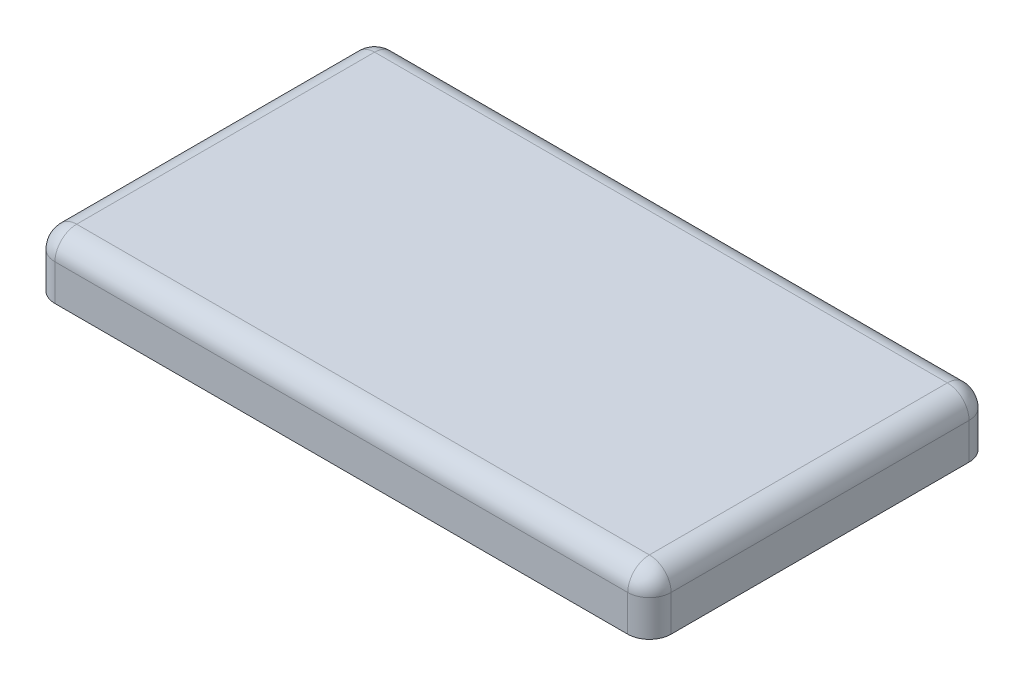
ISO-10303-21;
HEADER;
FILE_DESCRIPTION(('STEP AP214'),'2;1');
FILE_NAME('part.step','',(''),(''),'','','');
FILE_SCHEMA(('AUTOMOTIVE_DESIGN { 1 0 10303 214 1 1 1 1 }'));
ENDSEC;
DATA;
#1=APPLICATION_CONTEXT('core data for automotive mechanical design processes');
#2=APPLICATION_PROTOCOL_DEFINITION('international standard','automotive_design',2000,#1);
#3=PRODUCT_CONTEXT('',#1,'mechanical');
#4=PRODUCT('Part','Part','',(#3));
#5=PRODUCT_RELATED_PRODUCT_CATEGORY('part','',(#4));
#6=PRODUCT_DEFINITION_FORMATION('','',#4);
#7=PRODUCT_DEFINITION_CONTEXT('part definition',#1,'design');
#8=PRODUCT_DEFINITION('design','',#6,#7);
#9=PRODUCT_DEFINITION_SHAPE('','',#8);
#10=(LENGTH_UNIT() NAMED_UNIT(*) SI_UNIT(.MILLI.,.METRE.));
#11=(NAMED_UNIT(*) PLANE_ANGLE_UNIT() SI_UNIT($,.RADIAN.));
#12=(NAMED_UNIT(*) SI_UNIT($,.STERADIAN.) SOLID_ANGLE_UNIT());
#13=UNCERTAINTY_MEASURE_WITH_UNIT(LENGTH_MEASURE(1.E-05),#10,'distance_accuracy_value','');
#14=(GEOMETRIC_REPRESENTATION_CONTEXT(3) GLOBAL_UNCERTAINTY_ASSIGNED_CONTEXT((#13)) GLOBAL_UNIT_ASSIGNED_CONTEXT((#10,
#11,#12)) REPRESENTATION_CONTEXT('',''));
#15=CARTESIAN_POINT('',(0.,0.,0.));
#16=DIRECTION('',(0.,0.,1.));
#17=DIRECTION('',(1.,0.,0.));
#18=AXIS2_PLACEMENT_3D('',#15,#16,#17);
#19=CARTESIAN_POINT('',(0.,4.,0.));
#20=DIRECTION('',(1.,0.,0.));
#21=DIRECTION('',(0.,0.,-1.));
#22=AXIS2_PLACEMENT_3D('',#19,#20,#21);
#23=PLANE('',#22);
#24=DIRECTION('',(0.,0.,1.));
#25=VECTOR('',#24,1.);
#26=CARTESIAN_POINT('',(0.,0.,0.));
#27=LINE('',#26,#25);
#28=CARTESIAN_POINT('',(0.,0.,-22.1));
#29=VERTEX_POINT('',#28);
#30=CARTESIAN_POINT('',(0.,0.,-1.5));
#31=VERTEX_POINT('',#30);
#32=EDGE_CURVE('E175',#29,#31,#27,.T.);
#33=ORIENTED_EDGE('',*,*,#32,.T.);
#34=DIRECTION('',(0.,-1.,0.));
#35=VECTOR('',#34,1.);
#36=CARTESIAN_POINT('',(0.,4.,-1.5));
#37=LINE('',#36,#35);
#38=CARTESIAN_POINT('',(0.,2.5,-1.5));
#39=VERTEX_POINT('',#38);
#40=EDGE_CURVE('E51',#31,#39,#37,.F.);
#41=ORIENTED_EDGE('',*,*,#40,.T.);
#42=DIRECTION('',(0.,0.,1.));
#43=VECTOR('',#42,1.);
#44=CARTESIAN_POINT('',(0.,2.5,0.));
#45=LINE('',#44,#43);
#46=CARTESIAN_POINT('',(0.,2.5,-22.1));
#47=VERTEX_POINT('',#46);
#48=EDGE_CURVE('E56',#39,#47,#45,.F.);
#49=ORIENTED_EDGE('',*,*,#48,.T.);
#50=DIRECTION('',(0.,-1.,0.));
#51=VECTOR('',#50,1.);
#52=CARTESIAN_POINT('',(0.,4.,-22.1));
#53=LINE('',#52,#51);
#54=EDGE_CURVE('E217',#47,#29,#53,.T.);
#55=ORIENTED_EDGE('',*,*,#54,.T.);
#56=EDGE_LOOP('',(#33,#41,#49,#55));
#57=FACE_BOUND('',#56,.T.);
#58=ADVANCED_FACE('F34',(#57),#23,.F.);
#59=CARTESIAN_POINT('',(0.,4.,0.));
#60=DIRECTION('',(0.,0.,-1.));
#61=DIRECTION('',(-1.,0.,0.));
#62=AXIS2_PLACEMENT_3D('',#59,#60,#61);
#63=PLANE('',#62);
#64=DIRECTION('',(1.,0.,0.));
#65=VECTOR('',#64,1.);
#66=CARTESIAN_POINT('',(0.,2.5,0.));
#67=LINE('',#66,#65);
#68=CARTESIAN_POINT('',(41.1,2.5,0.));
#69=VERTEX_POINT('',#68);
#70=CARTESIAN_POINT('',(1.5,2.5,0.));
#71=VERTEX_POINT('',#70);
#72=EDGE_CURVE('E213',#69,#71,#67,.F.);
#73=ORIENTED_EDGE('',*,*,#72,.T.);
#74=DIRECTION('',(0.,-1.,0.));
#75=VECTOR('',#74,1.);
#76=CARTESIAN_POINT('',(1.5,4.,0.));
#77=LINE('',#76,#75);
#78=CARTESIAN_POINT('',(1.5,0.,0.));
#79=VERTEX_POINT('',#78);
#80=EDGE_CURVE('E215',#71,#79,#77,.T.);
#81=ORIENTED_EDGE('',*,*,#80,.T.);
#82=DIRECTION('',(1.,0.,0.));
#83=VECTOR('',#82,1.);
#84=CARTESIAN_POINT('',(0.,0.,0.));
#85=LINE('',#84,#83);
#86=CARTESIAN_POINT('',(41.1,0.,0.));
#87=VERTEX_POINT('',#86);
#88=EDGE_CURVE('E180',#79,#87,#85,.T.);
#89=ORIENTED_EDGE('',*,*,#88,.T.);
#90=DIRECTION('',(0.,-1.,0.));
#91=VECTOR('',#90,1.);
#92=CARTESIAN_POINT('',(41.1,4.,0.));
#93=LINE('',#92,#91);
#94=EDGE_CURVE('E211',#87,#69,#93,.F.);
#95=ORIENTED_EDGE('',*,*,#94,.T.);
#96=EDGE_LOOP('',(#73,#81,#89,#95));
#97=FACE_BOUND('',#96,.T.);
#98=ADVANCED_FACE('F282',(#97),#63,.F.);
#99=CARTESIAN_POINT('',(42.6,4.,0.));
#100=DIRECTION('',(-1.,0.,0.));
#101=DIRECTION('',(0.,0.,1.));
#102=AXIS2_PLACEMENT_3D('',#99,#100,#101);
#103=PLANE('',#102);
#104=DIRECTION('',(0.,0.,-1.));
#105=VECTOR('',#104,1.);
#106=CARTESIAN_POINT('',(42.6,0.,0.));
#107=LINE('',#106,#105);
#108=CARTESIAN_POINT('',(42.6,0.,-1.5));
#109=VERTEX_POINT('',#108);
#110=CARTESIAN_POINT('',(42.6,0.,-22.1));
#111=VERTEX_POINT('',#110);
#112=EDGE_CURVE('E183',#109,#111,#107,.T.);
#113=ORIENTED_EDGE('',*,*,#112,.T.);
#114=DIRECTION('',(0.,-1.,0.));
#115=VECTOR('',#114,1.);
#116=CARTESIAN_POINT('',(42.6,4.,-22.1));
#117=LINE('',#116,#115);
#118=CARTESIAN_POINT('',(42.6,2.5,-22.1));
#119=VERTEX_POINT('',#118);
#120=EDGE_CURVE('E209',#111,#119,#117,.F.);
#121=ORIENTED_EDGE('',*,*,#120,.T.);
#122=DIRECTION('',(0.,0.,-1.));
#123=VECTOR('',#122,1.);
#124=CARTESIAN_POINT('',(42.6,2.5,0.));
#125=LINE('',#124,#123);
#126=CARTESIAN_POINT('',(42.6,2.5,-1.5));
#127=VERTEX_POINT('',#126);
#128=EDGE_CURVE('E207',#119,#127,#125,.F.);
#129=ORIENTED_EDGE('',*,*,#128,.T.);
#130=DIRECTION('',(0.,-1.,0.));
#131=VECTOR('',#130,1.);
#132=CARTESIAN_POINT('',(42.6,4.,-1.5));
#133=LINE('',#132,#131);
#134=EDGE_CURVE('E205',#127,#109,#133,.T.);
#135=ORIENTED_EDGE('',*,*,#134,.T.);
#136=EDGE_LOOP('',(#113,#121,#129,#135));
#137=FACE_BOUND('',#136,.T.);
#138=ADVANCED_FACE('F315',(#137),#103,.F.);
#139=CARTESIAN_POINT('',(0.,4.,-23.6));
#140=DIRECTION('',(0.,0.,1.));
#141=DIRECTION('',(1.,0.,0.));
#142=AXIS2_PLACEMENT_3D('',#139,#140,#141);
#143=PLANE('',#142);
#144=DIRECTION('',(-1.,0.,0.));
#145=VECTOR('',#144,1.);
#146=CARTESIAN_POINT('',(0.,0.,-23.6));
#147=LINE('',#146,#145);
#148=CARTESIAN_POINT('',(41.1,0.,-23.6));
#149=VERTEX_POINT('',#148);
#150=CARTESIAN_POINT('',(1.49999999999999,0.,-23.6));
#151=VERTEX_POINT('',#150);
#152=EDGE_CURVE('E186',#149,#151,#147,.T.);
#153=ORIENTED_EDGE('',*,*,#152,.T.);
#154=DIRECTION('',(0.,-1.,0.));
#155=VECTOR('',#154,1.);
#156=CARTESIAN_POINT('',(1.49999999999999,4.,-23.6));
#157=LINE('',#156,#155);
#158=CARTESIAN_POINT('',(1.49999999999999,2.5,-23.6));
#159=VERTEX_POINT('',#158);
#160=EDGE_CURVE('E203',#151,#159,#157,.F.);
#161=ORIENTED_EDGE('',*,*,#160,.T.);
#162=DIRECTION('',(-1.,0.,0.));
#163=VECTOR('',#162,1.);
#164=CARTESIAN_POINT('',(0.,2.5,-23.6));
#165=LINE('',#164,#163);
#166=CARTESIAN_POINT('',(41.1,2.5,-23.6));
#167=VERTEX_POINT('',#166);
#168=EDGE_CURVE('E200',#159,#167,#165,.F.);
#169=ORIENTED_EDGE('',*,*,#168,.T.);
#170=DIRECTION('',(0.,-1.,0.));
#171=VECTOR('',#170,1.);
#172=CARTESIAN_POINT('',(41.1,4.,-23.6));
#173=LINE('',#172,#171);
#174=EDGE_CURVE('E198',#167,#149,#173,.T.);
#175=ORIENTED_EDGE('',*,*,#174,.T.);
#176=EDGE_LOOP('',(#153,#161,#169,#175));
#177=FACE_BOUND('',#176,.T.);
#178=ADVANCED_FACE('F306',(#177),#143,.F.);
#179=CARTESIAN_POINT('',(0.,4.,0.));
#180=DIRECTION('',(0.,-1.,0.));
#181=DIRECTION('',(0.,0.,-1.));
#182=AXIS2_PLACEMENT_3D('',#179,#180,#181);
#183=PLANE('',#182);
#184=DIRECTION('',(0.,0.,-1.));
#185=VECTOR('',#184,1.);
#186=CARTESIAN_POINT('',(41.1,4.,0.));
#187=LINE('',#186,#185);
#188=CARTESIAN_POINT('',(41.1,4.,-1.5));
#189=VERTEX_POINT('',#188);
#190=CARTESIAN_POINT('',(41.1,4.,-22.1));
#191=VERTEX_POINT('',#190);
#192=EDGE_CURVE('E193',#189,#191,#187,.T.);
#193=ORIENTED_EDGE('',*,*,#192,.T.);
#194=DIRECTION('',(-1.,0.,0.));
#195=VECTOR('',#194,1.);
#196=CARTESIAN_POINT('',(0.,4.,-22.1));
#197=LINE('',#196,#195);
#198=CARTESIAN_POINT('',(1.49999999999999,4.,-22.1));
#199=VERTEX_POINT('',#198);
#200=EDGE_CURVE('E195',#191,#199,#197,.T.);
#201=ORIENTED_EDGE('',*,*,#200,.T.);
#202=DIRECTION('',(0.,0.,1.));
#203=VECTOR('',#202,1.);
#204=CARTESIAN_POINT('',(1.5,4.,0.));
#205=LINE('',#204,#203);
#206=CARTESIAN_POINT('',(1.5,4.,-1.5));
#207=VERTEX_POINT('',#206);
#208=EDGE_CURVE('E189',#199,#207,#205,.T.);
#209=ORIENTED_EDGE('',*,*,#208,.T.);
#210=DIRECTION('',(1.,0.,0.));
#211=VECTOR('',#210,1.);
#212=CARTESIAN_POINT('',(0.,4.,-1.5));
#213=LINE('',#212,#211);
#214=EDGE_CURVE('E191',#207,#189,#213,.T.);
#215=ORIENTED_EDGE('',*,*,#214,.T.);
#216=EDGE_LOOP('',(#193,#201,#209,#215));
#217=FACE_BOUND('',#216,.T.);
#218=ADVANCED_FACE('F272',(#217),#183,.F.);
#219=CARTESIAN_POINT('',(0.,0.,0.));
#220=DIRECTION('',(0.,-1.,0.));
#221=DIRECTION('',(0.,0.,-1.));
#222=AXIS2_PLACEMENT_3D('',#219,#220,#221);
#223=PLANE('',#222);
#224=DIRECTION('',(0.,0.,1.));
#225=VECTOR('',#224,1.);
#226=CARTESIAN_POINT('',(41.35,0.,-22.35));
#227=LINE('',#226,#225);
#228=CARTESIAN_POINT('',(41.35,0.,-22.35));
#229=VERTEX_POINT('',#228);
#230=CARTESIAN_POINT('',(41.35,0.,-1.25));
#231=VERTEX_POINT('',#230);
#232=EDGE_CURVE('E143',#229,#231,#227,.T.);
#233=ORIENTED_EDGE('',*,*,#232,.F.);
#234=DIRECTION('',(1.,0.,0.));
#235=VECTOR('',#234,1.);
#236=CARTESIAN_POINT('',(1.24999999999999,0.,-22.35));
#237=LINE('',#236,#235);
#238=CARTESIAN_POINT('',(1.24999999999999,0.,-22.35));
#239=VERTEX_POINT('',#238);
#240=EDGE_CURVE('E160',#239,#229,#237,.T.);
#241=ORIENTED_EDGE('',*,*,#240,.F.);
#242=DIRECTION('',(0.,0.,-1.));
#243=VECTOR('',#242,1.);
#244=CARTESIAN_POINT('',(1.24999999999999,0.,-22.35));
#245=LINE('',#244,#243);
#246=CARTESIAN_POINT('',(1.24999999999999,0.,-1.25));
#247=VERTEX_POINT('',#246);
#248=EDGE_CURVE('E163',#247,#239,#245,.T.);
#249=ORIENTED_EDGE('',*,*,#248,.F.);
#250=DIRECTION('',(-1.,0.,0.));
#251=VECTOR('',#250,1.);
#252=CARTESIAN_POINT('',(1.24999999999999,0.,-1.25));
#253=LINE('',#252,#251);
#254=EDGE_CURVE('E169',#231,#247,#253,.T.);
#255=ORIENTED_EDGE('',*,*,#254,.F.);
#256=EDGE_LOOP('',(#233,#241,#249,#255));
#257=FACE_BOUND('',#256,.T.);
#258=ORIENTED_EDGE('',*,*,#88,.F.);
#259=CARTESIAN_POINT('',(1.5,0.,-1.5));
#260=DIRECTION('',(0.,-1.,0.));
#261=DIRECTION('',(0.,0.,-1.));
#262=AXIS2_PLACEMENT_3D('',#259,#260,#261);
#263=CIRCLE('',#262,1.5);
#264=EDGE_CURVE('E11',#79,#31,#263,.T.);
#265=ORIENTED_EDGE('',*,*,#264,.T.);
#266=ORIENTED_EDGE('',*,*,#32,.F.);
#267=CARTESIAN_POINT('',(1.49999999999999,0.,-22.1));
#268=DIRECTION('',(0.,-1.,0.));
#269=DIRECTION('',(0.,0.,-1.));
#270=AXIS2_PLACEMENT_3D('',#267,#268,#269);
#271=CIRCLE('',#270,1.5);
#272=EDGE_CURVE('E43',#29,#151,#271,.T.);
#273=ORIENTED_EDGE('',*,*,#272,.T.);
#274=ORIENTED_EDGE('',*,*,#152,.F.);
#275=CARTESIAN_POINT('',(41.1,0.,-22.1));
#276=DIRECTION('',(0.,-1.,0.));
#277=DIRECTION('',(0.,0.,-1.));
#278=AXIS2_PLACEMENT_3D('',#275,#276,#277);
#279=CIRCLE('',#278,1.5);
#280=EDGE_CURVE('E223',#149,#111,#279,.T.);
#281=ORIENTED_EDGE('',*,*,#280,.T.);
#282=ORIENTED_EDGE('',*,*,#112,.F.);
#283=CARTESIAN_POINT('',(41.1,0.,-1.5));
#284=DIRECTION('',(0.,-1.,0.));
#285=DIRECTION('',(0.,0.,-1.));
#286=AXIS2_PLACEMENT_3D('',#283,#284,#285);
#287=CIRCLE('',#286,1.5);
#288=EDGE_CURVE('E221',#109,#87,#287,.T.);
#289=ORIENTED_EDGE('',*,*,#288,.T.);
#290=EDGE_LOOP('',(#258,#265,#266,#273,#274,#281,#282,#289));
#291=FACE_BOUND('',#290,.T.);
#292=ADVANCED_FACE('F290',(#257,#291),#223,.T.);
#293=CARTESIAN_POINT('',(41.35,2.6,-22.35));
#294=DIRECTION('',(1.,0.,0.));
#295=DIRECTION('',(0.,0.,-1.));
#296=AXIS2_PLACEMENT_3D('',#293,#294,#295);
#297=PLANE('',#296);
#298=ORIENTED_EDGE('',*,*,#232,.T.);
#299=DIRECTION('',(0.,-1.,0.));
#300=VECTOR('',#299,1.);
#301=CARTESIAN_POINT('',(41.35,2.6,-1.25));
#302=LINE('',#301,#300);
#303=CARTESIAN_POINT('',(41.35,2.6,-1.25));
#304=VERTEX_POINT('',#303);
#305=EDGE_CURVE('E136',#304,#231,#302,.T.);
#306=ORIENTED_EDGE('',*,*,#305,.F.);
#307=DIRECTION('',(0.,0.,1.));
#308=VECTOR('',#307,1.);
#309=CARTESIAN_POINT('',(41.35,2.6,-22.35));
#310=LINE('',#309,#308);
#311=CARTESIAN_POINT('',(41.35,2.6,-22.35));
#312=VERTEX_POINT('',#311);
#313=EDGE_CURVE('E140',#312,#304,#310,.T.);
#314=ORIENTED_EDGE('',*,*,#313,.F.);
#315=DIRECTION('',(0.,-1.,0.));
#316=VECTOR('',#315,1.);
#317=CARTESIAN_POINT('',(41.35,2.6,-22.35));
#318=LINE('',#317,#316);
#319=EDGE_CURVE('E173',#312,#229,#318,.T.);
#320=ORIENTED_EDGE('',*,*,#319,.T.);
#321=EDGE_LOOP('',(#298,#306,#314,#320));
#322=FACE_BOUND('',#321,.T.);
#323=ADVANCED_FACE('F138',(#322),#297,.F.);
#324=CARTESIAN_POINT('',(1.24999999999999,2.6,-22.35));
#325=DIRECTION('',(0.,0.,-1.));
#326=DIRECTION('',(-1.,0.,0.));
#327=AXIS2_PLACEMENT_3D('',#324,#325,#326);
#328=PLANE('',#327);
#329=ORIENTED_EDGE('',*,*,#240,.T.);
#330=ORIENTED_EDGE('',*,*,#319,.F.);
#331=DIRECTION('',(1.,0.,0.));
#332=VECTOR('',#331,1.);
#333=CARTESIAN_POINT('',(1.24999999999999,2.6,-22.35));
#334=LINE('',#333,#332);
#335=CARTESIAN_POINT('',(1.24999999999999,2.6,-22.35));
#336=VERTEX_POINT('',#335);
#337=EDGE_CURVE('E148',#336,#312,#334,.T.);
#338=ORIENTED_EDGE('',*,*,#337,.F.);
#339=DIRECTION('',(0.,-1.,0.));
#340=VECTOR('',#339,1.);
#341=CARTESIAN_POINT('',(1.24999999999999,2.6,-22.35));
#342=LINE('',#341,#340);
#343=EDGE_CURVE('E176',#336,#239,#342,.T.);
#344=ORIENTED_EDGE('',*,*,#343,.T.);
#345=EDGE_LOOP('',(#329,#330,#338,#344));
#346=FACE_BOUND('',#345,.T.);
#347=ADVANCED_FACE('F444',(#346),#328,.F.);
#348=CARTESIAN_POINT('',(1.24999999999999,2.6,-22.35));
#349=DIRECTION('',(-1.,0.,0.));
#350=DIRECTION('',(0.,0.,1.));
#351=AXIS2_PLACEMENT_3D('',#348,#349,#350);
#352=PLANE('',#351);
#353=ORIENTED_EDGE('',*,*,#248,.T.);
#354=ORIENTED_EDGE('',*,*,#343,.F.);
#355=DIRECTION('',(0.,0.,-1.));
#356=VECTOR('',#355,1.);
#357=CARTESIAN_POINT('',(1.24999999999999,2.6,-22.35));
#358=LINE('',#357,#356);
#359=CARTESIAN_POINT('',(1.24999999999999,2.6,-1.25));
#360=VERTEX_POINT('',#359);
#361=EDGE_CURVE('E156',#360,#336,#358,.T.);
#362=ORIENTED_EDGE('',*,*,#361,.F.);
#363=DIRECTION('',(0.,-1.,0.));
#364=VECTOR('',#363,1.);
#365=CARTESIAN_POINT('',(1.24999999999999,2.6,-1.25));
#366=LINE('',#365,#364);
#367=EDGE_CURVE('E147',#360,#247,#366,.T.);
#368=ORIENTED_EDGE('',*,*,#367,.T.);
#369=EDGE_LOOP('',(#353,#354,#362,#368));
#370=FACE_BOUND('',#369,.T.);
#371=ADVANCED_FACE('F436',(#370),#352,.F.);
#372=CARTESIAN_POINT('',(1.24999999999999,2.6,-1.25));
#373=DIRECTION('',(0.,0.,1.));
#374=DIRECTION('',(1.,0.,0.));
#375=AXIS2_PLACEMENT_3D('',#372,#373,#374);
#376=PLANE('',#375);
#377=ORIENTED_EDGE('',*,*,#254,.T.);
#378=ORIENTED_EDGE('',*,*,#367,.F.);
#379=DIRECTION('',(-1.,0.,0.));
#380=VECTOR('',#379,1.);
#381=CARTESIAN_POINT('',(1.24999999999999,2.6,-1.25));
#382=LINE('',#381,#380);
#383=EDGE_CURVE('E151',#304,#360,#382,.T.);
#384=ORIENTED_EDGE('',*,*,#383,.F.);
#385=ORIENTED_EDGE('',*,*,#305,.T.);
#386=EDGE_LOOP('',(#377,#378,#384,#385));
#387=FACE_BOUND('',#386,.T.);
#388=ADVANCED_FACE('F152',(#387),#376,.F.);
#389=CARTESIAN_POINT('',(0.,2.6,0.));
#390=DIRECTION('',(0.,1.,0.));
#391=DIRECTION('',(0.,0.,1.));
#392=AXIS2_PLACEMENT_3D('',#389,#390,#391);
#393=PLANE('',#392);
#394=ORIENTED_EDGE('',*,*,#313,.T.);
#395=ORIENTED_EDGE('',*,*,#383,.T.);
#396=ORIENTED_EDGE('',*,*,#361,.T.);
#397=ORIENTED_EDGE('',*,*,#337,.T.);
#398=EDGE_LOOP('',(#394,#395,#396,#397));
#399=FACE_BOUND('',#398,.T.);
#400=ADVANCED_FACE('F158',(#399),#393,.F.);
#401=CARTESIAN_POINT('',(41.1,4.,-1.5));
#402=DIRECTION('',(0.,-1.,0.));
#403=DIRECTION('',(0.,0.,-1.));
#404=AXIS2_PLACEMENT_3D('',#401,#402,#403);
#405=CYLINDRICAL_SURFACE('',#404,1.5);
#406=ORIENTED_EDGE('',*,*,#288,.F.);
#407=ORIENTED_EDGE('',*,*,#134,.F.);
#408=CARTESIAN_POINT('',(41.1,2.5,-1.5));
#409=DIRECTION('',(0.,1.,0.));
#410=DIRECTION('',(0.,0.,1.));
#411=AXIS2_PLACEMENT_3D('',#408,#409,#410);
#412=CIRCLE('',#411,1.5);
#413=EDGE_CURVE('E38',#69,#127,#412,.T.);
#414=ORIENTED_EDGE('',*,*,#413,.F.);
#415=ORIENTED_EDGE('',*,*,#94,.F.);
#416=EDGE_LOOP('',(#406,#407,#414,#415));
#417=FACE_BOUND('',#416,.T.);
#418=ADVANCED_FACE('F36',(#417),#405,.T.);
#419=CARTESIAN_POINT('',(0.,2.5,-1.5));
#420=DIRECTION('',(1.,0.,0.));
#421=DIRECTION('',(0.,0.,-1.));
#422=AXIS2_PLACEMENT_3D('',#419,#420,#421);
#423=CYLINDRICAL_SURFACE('',#422,1.5);
#424=CARTESIAN_POINT('',(1.5,2.5,-1.5));
#425=DIRECTION('',(-1.,0.,0.));
#426=DIRECTION('',(0.,0.,1.));
#427=AXIS2_PLACEMENT_3D('',#424,#425,#426);
#428=CIRCLE('',#427,1.5);
#429=EDGE_CURVE('E251',#71,#207,#428,.T.);
#430=ORIENTED_EDGE('',*,*,#429,.F.);
#431=ORIENTED_EDGE('',*,*,#72,.F.);
#432=CARTESIAN_POINT('',(41.1,2.5,-1.5));
#433=DIRECTION('',(1.,0.,0.));
#434=DIRECTION('',(0.,0.,-1.));
#435=AXIS2_PLACEMENT_3D('',#432,#433,#434);
#436=CIRCLE('',#435,1.5);
#437=EDGE_CURVE('E253',#189,#69,#436,.T.);
#438=ORIENTED_EDGE('',*,*,#437,.F.);
#439=ORIENTED_EDGE('',*,*,#214,.F.);
#440=EDGE_LOOP('',(#430,#431,#438,#439));
#441=FACE_BOUND('',#440,.T.);
#442=ADVANCED_FACE('F279',(#441),#423,.T.);
#443=CARTESIAN_POINT('',(1.5,4.,-1.5));
#444=DIRECTION('',(0.,-1.,0.));
#445=DIRECTION('',(0.,0.,-1.));
#446=AXIS2_PLACEMENT_3D('',#443,#444,#445);
#447=CYLINDRICAL_SURFACE('',#446,1.5);
#448=ORIENTED_EDGE('',*,*,#264,.F.);
#449=ORIENTED_EDGE('',*,*,#80,.F.);
#450=CARTESIAN_POINT('',(1.5,2.5,-1.5));
#451=DIRECTION('',(0.,1.,0.));
#452=DIRECTION('',(0.,0.,1.));
#453=AXIS2_PLACEMENT_3D('',#450,#451,#452);
#454=CIRCLE('',#453,1.5);
#455=EDGE_CURVE('E248',#39,#71,#454,.T.);
#456=ORIENTED_EDGE('',*,*,#455,.F.);
#457=ORIENTED_EDGE('',*,*,#40,.F.);
#458=EDGE_LOOP('',(#448,#449,#456,#457));
#459=FACE_BOUND('',#458,.T.);
#460=ADVANCED_FACE('F286',(#459),#447,.T.);
#461=CARTESIAN_POINT('',(41.1,2.5,-1.5));
#462=DIRECTION('',(0.,0.,1.));
#463=DIRECTION('',(1.,0.,0.));
#464=AXIS2_PLACEMENT_3D('',#461,#462,#463);
#465=SPHERICAL_SURFACE('',#464,1.5);
#466=ORIENTED_EDGE('',*,*,#437,.T.);
#467=ORIENTED_EDGE('',*,*,#413,.T.);
#468=CARTESIAN_POINT('',(41.1,2.5,-1.5));
#469=DIRECTION('',(0.,0.,1.));
#470=DIRECTION('',(1.,0.,0.));
#471=AXIS2_PLACEMENT_3D('',#468,#469,#470);
#472=CIRCLE('',#471,1.5);
#473=EDGE_CURVE('E245',#189,#127,#472,.F.);
#474=ORIENTED_EDGE('',*,*,#473,.F.);
#475=EDGE_LOOP('',(#466,#467,#474));
#476=FACE_BOUND('',#475,.T.);
#477=ADVANCED_FACE('F260',(#476),#465,.T.);
#478=CARTESIAN_POINT('',(1.5,2.5,-1.5));
#479=DIRECTION('',(0.,0.,1.));
#480=DIRECTION('',(1.,0.,0.));
#481=AXIS2_PLACEMENT_3D('',#478,#479,#480);
#482=SPHERICAL_SURFACE('',#481,1.5);
#483=ORIENTED_EDGE('',*,*,#455,.T.);
#484=ORIENTED_EDGE('',*,*,#429,.T.);
#485=CARTESIAN_POINT('',(1.5,2.5,-1.5));
#486=DIRECTION('',(0.,0.,1.));
#487=DIRECTION('',(1.,0.,0.));
#488=AXIS2_PLACEMENT_3D('',#485,#486,#487);
#489=CIRCLE('',#488,1.5);
#490=EDGE_CURVE('E242',#39,#207,#489,.F.);
#491=ORIENTED_EDGE('',*,*,#490,.F.);
#492=EDGE_LOOP('',(#483,#484,#491));
#493=FACE_BOUND('',#492,.T.);
#494=ADVANCED_FACE('F348',(#493),#482,.T.);
#495=CARTESIAN_POINT('',(41.1,4.,-22.1));
#496=DIRECTION('',(0.,-1.,0.));
#497=DIRECTION('',(0.,0.,-1.));
#498=AXIS2_PLACEMENT_3D('',#495,#496,#497);
#499=CYLINDRICAL_SURFACE('',#498,1.5);
#500=ORIENTED_EDGE('',*,*,#280,.F.);
#501=ORIENTED_EDGE('',*,*,#174,.F.);
#502=CARTESIAN_POINT('',(41.1,2.5,-22.1));
#503=DIRECTION('',(0.,1.,0.));
#504=DIRECTION('',(0.,0.,1.));
#505=AXIS2_PLACEMENT_3D('',#502,#503,#504);
#506=CIRCLE('',#505,1.5);
#507=EDGE_CURVE('E239',#119,#167,#506,.T.);
#508=ORIENTED_EDGE('',*,*,#507,.F.);
#509=ORIENTED_EDGE('',*,*,#120,.F.);
#510=EDGE_LOOP('',(#500,#501,#508,#509));
#511=FACE_BOUND('',#510,.T.);
#512=ADVANCED_FACE('F313',(#511),#499,.T.);
#513=CARTESIAN_POINT('',(41.1,2.5,0.));
#514=DIRECTION('',(0.,0.,-1.));
#515=DIRECTION('',(-1.,0.,0.));
#516=AXIS2_PLACEMENT_3D('',#513,#514,#515);
#517=CYLINDRICAL_SURFACE('',#516,1.5);
#518=ORIENTED_EDGE('',*,*,#473,.T.);
#519=ORIENTED_EDGE('',*,*,#128,.F.);
#520=CARTESIAN_POINT('',(41.1,2.5,-22.1));
#521=DIRECTION('',(0.,0.,-1.));
#522=DIRECTION('',(-1.,0.,0.));
#523=AXIS2_PLACEMENT_3D('',#520,#521,#522);
#524=CIRCLE('',#523,1.5);
#525=EDGE_CURVE('E236',#191,#119,#524,.T.);
#526=ORIENTED_EDGE('',*,*,#525,.F.);
#527=ORIENTED_EDGE('',*,*,#192,.F.);
#528=EDGE_LOOP('',(#518,#519,#526,#527));
#529=FACE_BOUND('',#528,.T.);
#530=ADVANCED_FACE('F267',(#529),#517,.T.);
#531=CARTESIAN_POINT('',(1.5,2.5,0.));
#532=DIRECTION('',(0.,0.,1.));
#533=DIRECTION('',(1.,0.,0.));
#534=AXIS2_PLACEMENT_3D('',#531,#532,#533);
#535=CYLINDRICAL_SURFACE('',#534,1.5);
#536=ORIENTED_EDGE('',*,*,#490,.T.);
#537=ORIENTED_EDGE('',*,*,#208,.F.);
#538=CARTESIAN_POINT('',(1.49999999999999,2.5,-22.1));
#539=DIRECTION('',(0.,0.,-1.));
#540=DIRECTION('',(-1.,0.,0.));
#541=AXIS2_PLACEMENT_3D('',#538,#539,#540);
#542=CIRCLE('',#541,1.5);
#543=EDGE_CURVE('E233',#47,#199,#542,.T.);
#544=ORIENTED_EDGE('',*,*,#543,.F.);
#545=ORIENTED_EDGE('',*,*,#48,.F.);
#546=EDGE_LOOP('',(#536,#537,#544,#545));
#547=FACE_BOUND('',#546,.T.);
#548=ADVANCED_FACE('F299',(#547),#535,.T.);
#549=CARTESIAN_POINT('',(1.49999999999999,4.,-22.1));
#550=DIRECTION('',(0.,-1.,0.));
#551=DIRECTION('',(0.,0.,-1.));
#552=AXIS2_PLACEMENT_3D('',#549,#550,#551);
#553=CYLINDRICAL_SURFACE('',#552,1.5);
#554=ORIENTED_EDGE('',*,*,#272,.F.);
#555=ORIENTED_EDGE('',*,*,#54,.F.);
#556=CARTESIAN_POINT('',(1.49999999999999,2.5,-22.1));
#557=DIRECTION('',(0.,1.,0.));
#558=DIRECTION('',(0.,0.,1.));
#559=AXIS2_PLACEMENT_3D('',#556,#557,#558);
#560=CIRCLE('',#559,1.5);
#561=EDGE_CURVE('E230',#159,#47,#560,.T.);
#562=ORIENTED_EDGE('',*,*,#561,.F.);
#563=ORIENTED_EDGE('',*,*,#160,.F.);
#564=EDGE_LOOP('',(#554,#555,#562,#563));
#565=FACE_BOUND('',#564,.T.);
#566=ADVANCED_FACE('F295',(#565),#553,.T.);
#567=CARTESIAN_POINT('',(41.1,2.5,-22.1));
#568=DIRECTION('',(0.,0.,1.));
#569=DIRECTION('',(1.,0.,0.));
#570=AXIS2_PLACEMENT_3D('',#567,#568,#569);
#571=SPHERICAL_SURFACE('',#570,1.5);
#572=ORIENTED_EDGE('',*,*,#525,.T.);
#573=ORIENTED_EDGE('',*,*,#507,.T.);
#574=CARTESIAN_POINT('',(41.1,2.5,-22.1));
#575=DIRECTION('',(1.,0.,0.));
#576=DIRECTION('',(0.,0.,-1.));
#577=AXIS2_PLACEMENT_3D('',#574,#575,#576);
#578=CIRCLE('',#577,1.5);
#579=EDGE_CURVE('E228',#191,#167,#578,.F.);
#580=ORIENTED_EDGE('',*,*,#579,.F.);
#581=EDGE_LOOP('',(#572,#573,#580));
#582=FACE_BOUND('',#581,.T.);
#583=ADVANCED_FACE('F336',(#582),#571,.T.);
#584=CARTESIAN_POINT('',(1.49999999999999,2.5,-22.1));
#585=DIRECTION('',(0.,0.,1.));
#586=DIRECTION('',(1.,0.,0.));
#587=AXIS2_PLACEMENT_3D('',#584,#585,#586);
#588=SPHERICAL_SURFACE('',#587,1.5);
#589=ORIENTED_EDGE('',*,*,#561,.T.);
#590=ORIENTED_EDGE('',*,*,#543,.T.);
#591=CARTESIAN_POINT('',(1.49999999999999,2.5,-22.1));
#592=DIRECTION('',(-1.,0.,0.));
#593=DIRECTION('',(0.,0.,1.));
#594=AXIS2_PLACEMENT_3D('',#591,#592,#593);
#595=CIRCLE('',#594,1.5);
#596=EDGE_CURVE('E226',#159,#199,#595,.F.);
#597=ORIENTED_EDGE('',*,*,#596,.F.);
#598=EDGE_LOOP('',(#589,#590,#597));
#599=FACE_BOUND('',#598,.T.);
#600=ADVANCED_FACE('F302',(#599),#588,.T.);
#601=CARTESIAN_POINT('',(0.,2.5,-22.1));
#602=DIRECTION('',(-1.,0.,0.));
#603=DIRECTION('',(0.,0.,1.));
#604=AXIS2_PLACEMENT_3D('',#601,#602,#603);
#605=CYLINDRICAL_SURFACE('',#604,1.5);
#606=ORIENTED_EDGE('',*,*,#579,.T.);
#607=ORIENTED_EDGE('',*,*,#168,.F.);
#608=ORIENTED_EDGE('',*,*,#596,.T.);
#609=ORIENTED_EDGE('',*,*,#200,.F.);
#610=EDGE_LOOP('',(#606,#607,#608,#609));
#611=FACE_BOUND('',#610,.T.);
#612=ADVANCED_FACE('F304',(#611),#605,.T.);
#613=CLOSED_SHELL('',(#58,#98,#138,#178,#218,#292,#323,#347,#371,#388,#400,#418,#442,#460,#477,
#494,#512,#530,#548,#566,#583,#600,#612));
#614=MANIFOLD_SOLID_BREP('B2',#613);
#615=ADVANCED_BREP_SHAPE_REPRESENTATION('',(#18,#614),#14);
#616=SHAPE_DEFINITION_REPRESENTATION(#9,#615);
ENDSEC;
END-ISO-10303-21;
